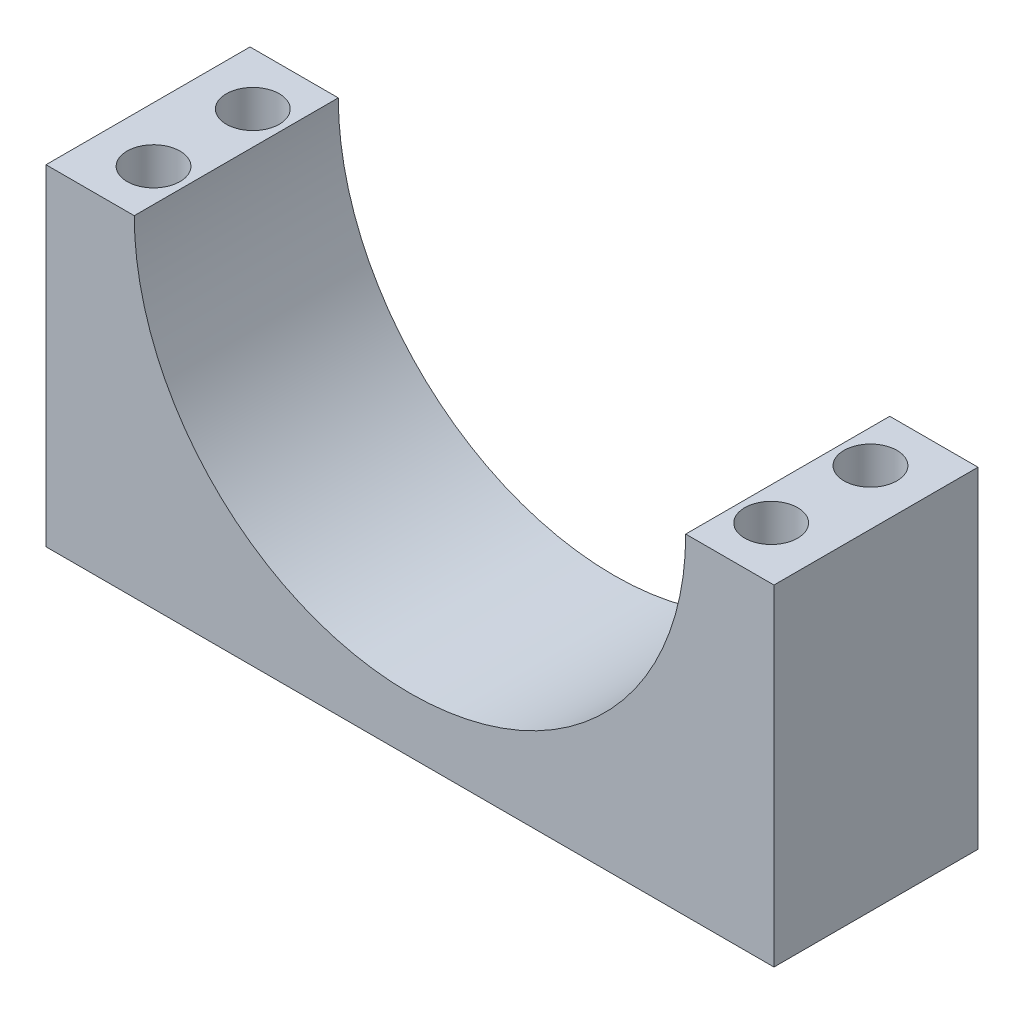
ISO-10303-21;
HEADER;
FILE_DESCRIPTION(('STEP AP214'),'2;1');
FILE_NAME('part.step','',(''),(''),'','','');
FILE_SCHEMA(('AUTOMOTIVE_DESIGN { 1 0 10303 214 1 1 1 1 }'));
ENDSEC;
DATA;
#1=APPLICATION_CONTEXT('core data for automotive mechanical design processes');
#2=APPLICATION_PROTOCOL_DEFINITION('international standard','automotive_design',2000,#1);
#3=PRODUCT_CONTEXT('',#1,'mechanical');
#4=PRODUCT('Part','Part','',(#3));
#5=PRODUCT_RELATED_PRODUCT_CATEGORY('part','',(#4));
#6=PRODUCT_DEFINITION_FORMATION('','',#4);
#7=PRODUCT_DEFINITION_CONTEXT('part definition',#1,'design');
#8=PRODUCT_DEFINITION('design','',#6,#7);
#9=PRODUCT_DEFINITION_SHAPE('','',#8);
#10=(LENGTH_UNIT() NAMED_UNIT(*) SI_UNIT(.MILLI.,.METRE.));
#11=(NAMED_UNIT(*) PLANE_ANGLE_UNIT() SI_UNIT($,.RADIAN.));
#12=(NAMED_UNIT(*) SI_UNIT($,.STERADIAN.) SOLID_ANGLE_UNIT());
#13=UNCERTAINTY_MEASURE_WITH_UNIT(LENGTH_MEASURE(1.E-05),#10,'distance_accuracy_value','');
#14=(GEOMETRIC_REPRESENTATION_CONTEXT(3) GLOBAL_UNCERTAINTY_ASSIGNED_CONTEXT((#13)) GLOBAL_UNIT_ASSIGNED_CONTEXT((#10,
#11,#12)) REPRESENTATION_CONTEXT('',''));
#15=CARTESIAN_POINT('',(0.,0.,0.));
#16=DIRECTION('',(0.,0.,1.));
#17=DIRECTION('',(1.,0.,0.));
#18=AXIS2_PLACEMENT_3D('',#15,#16,#17);
#19=CARTESIAN_POINT('',(0.,30.,18.5));
#20=DIRECTION('',(0.,-1.,0.));
#21=DIRECTION('',(0.,0.,-1.));
#22=AXIS2_PLACEMENT_3D('',#19,#20,#21);
#23=PLANE('',#22);
#24=CARTESIAN_POINT('',(61.,30.,13.75));
#25=DIRECTION('',(0.,-1.,0.));
#26=DIRECTION('',(0.,0.,-1.));
#27=AXIS2_PLACEMENT_3D('',#24,#25,#26);
#28=CIRCLE('',#27,2.39999999999999);
#29=CARTESIAN_POINT('',(61.,30.,11.35));
#30=VERTEX_POINT('',#29);
#31=EDGE_CURVE('E149',#30,#30,#28,.T.);
#32=ORIENTED_EDGE('',*,*,#31,.T.);
#33=EDGE_LOOP('',(#32));
#34=FACE_BOUND('',#33,.T.);
#35=CARTESIAN_POINT('',(61.,30.,4.75));
#36=DIRECTION('',(0.,-1.,0.));
#37=DIRECTION('',(0.,0.,-1.));
#38=AXIS2_PLACEMENT_3D('',#35,#36,#37);
#39=CIRCLE('',#38,2.39999999999999);
#40=CARTESIAN_POINT('',(61.,30.,2.35000000000001));
#41=VERTEX_POINT('',#40);
#42=EDGE_CURVE('E137',#41,#41,#39,.T.);
#43=ORIENTED_EDGE('',*,*,#42,.T.);
#44=EDGE_LOOP('',(#43));
#45=FACE_BOUND('',#44,.T.);
#46=DIRECTION('',(-1.,0.,0.));
#47=VECTOR('',#46,1.);
#48=CARTESIAN_POINT('',(0.,30.,0.));
#49=LINE('',#48,#47);
#50=CARTESIAN_POINT('',(66.,30.,0.));
#51=VERTEX_POINT('',#50);
#52=CARTESIAN_POINT('',(58.,30.,0.));
#53=VERTEX_POINT('',#52);
#54=EDGE_CURVE('E107',#51,#53,#49,.T.);
#55=ORIENTED_EDGE('',*,*,#54,.T.);
#56=DIRECTION('',(0.,0.,1.));
#57=VECTOR('',#56,1.);
#58=CARTESIAN_POINT('',(58.,30.,0.));
#59=LINE('',#58,#57);
#60=CARTESIAN_POINT('',(58.,30.,18.5));
#61=VERTEX_POINT('',#60);
#62=EDGE_CURVE('E49',#53,#61,#59,.T.);
#63=ORIENTED_EDGE('',*,*,#62,.T.);
#64=DIRECTION('',(-1.,0.,0.));
#65=VECTOR('',#64,1.);
#66=CARTESIAN_POINT('',(0.,30.,18.5));
#67=LINE('',#66,#65);
#68=CARTESIAN_POINT('',(66.,30.,18.5));
#69=VERTEX_POINT('',#68);
#70=EDGE_CURVE('E118',#69,#61,#67,.T.);
#71=ORIENTED_EDGE('',*,*,#70,.F.);
#72=DIRECTION('',(0.,0.,-1.));
#73=VECTOR('',#72,1.);
#74=CARTESIAN_POINT('',(66.,30.,18.5));
#75=LINE('',#74,#73);
#76=EDGE_CURVE('E117',#69,#51,#75,.T.);
#77=ORIENTED_EDGE('',*,*,#76,.T.);
#78=EDGE_LOOP('',(#55,#63,#71,#77));
#79=FACE_BOUND('',#78,.T.);
#80=ADVANCED_FACE('F35',(#34,#45,#79),#23,.F.);
#81=CARTESIAN_POINT('',(0.,0.,18.5));
#82=DIRECTION('',(1.,0.,0.));
#83=DIRECTION('',(0.,0.,-1.));
#84=AXIS2_PLACEMENT_3D('',#81,#82,#83);
#85=PLANE('',#84);
#86=DIRECTION('',(0.,-1.,0.));
#87=VECTOR('',#86,1.);
#88=CARTESIAN_POINT('',(0.,0.,0.));
#89=LINE('',#88,#87);
#90=CARTESIAN_POINT('',(0.,30.,0.));
#91=VERTEX_POINT('',#90);
#92=CARTESIAN_POINT('',(0.,0.,0.));
#93=VERTEX_POINT('',#92);
#94=EDGE_CURVE('E106',#91,#93,#89,.T.);
#95=ORIENTED_EDGE('',*,*,#94,.T.);
#96=DIRECTION('',(0.,0.,-1.));
#97=VECTOR('',#96,1.);
#98=CARTESIAN_POINT('',(0.,0.,18.5));
#99=LINE('',#98,#97);
#100=CARTESIAN_POINT('',(0.,0.,18.5));
#101=VERTEX_POINT('',#100);
#102=EDGE_CURVE('E43',#101,#93,#99,.T.);
#103=ORIENTED_EDGE('',*,*,#102,.F.);
#104=DIRECTION('',(0.,-1.,0.));
#105=VECTOR('',#104,1.);
#106=CARTESIAN_POINT('',(0.,0.,18.5));
#107=LINE('',#106,#105);
#108=CARTESIAN_POINT('',(0.,30.,18.5));
#109=VERTEX_POINT('',#108);
#110=EDGE_CURVE('E110',#109,#101,#107,.T.);
#111=ORIENTED_EDGE('',*,*,#110,.F.);
#112=DIRECTION('',(0.,0.,-1.));
#113=VECTOR('',#112,1.);
#114=CARTESIAN_POINT('',(0.,30.,18.5));
#115=LINE('',#114,#113);
#116=EDGE_CURVE('E115',#109,#91,#115,.T.);
#117=ORIENTED_EDGE('',*,*,#116,.T.);
#118=EDGE_LOOP('',(#95,#103,#111,#117));
#119=FACE_BOUND('',#118,.T.);
#120=ADVANCED_FACE('F37',(#119),#85,.F.);
#121=CARTESIAN_POINT('',(0.,0.,18.5));
#122=DIRECTION('',(0.,1.,0.));
#123=DIRECTION('',(0.,0.,1.));
#124=AXIS2_PLACEMENT_3D('',#121,#122,#123);
#125=PLANE('',#124);
#126=CARTESIAN_POINT('',(5.00000000000001,0.,13.75));
#127=DIRECTION('',(0.,-1.,0.));
#128=DIRECTION('',(0.,0.,-1.));
#129=AXIS2_PLACEMENT_3D('',#126,#127,#128);
#130=CIRCLE('',#129,3.99999999999999);
#131=CARTESIAN_POINT('',(5.00000000000001,0.,9.75000000000001));
#132=VERTEX_POINT('',#131);
#133=EDGE_CURVE('E182',#132,#132,#130,.T.);
#134=ORIENTED_EDGE('',*,*,#133,.F.);
#135=EDGE_LOOP('',(#134));
#136=FACE_BOUND('',#135,.T.);
#137=CARTESIAN_POINT('',(5.00000000000001,0.,4.75));
#138=DIRECTION('',(0.,-1.,0.));
#139=DIRECTION('',(0.,0.,-1.));
#140=AXIS2_PLACEMENT_3D('',#137,#138,#139);
#141=CIRCLE('',#140,3.99999999999999);
#142=CARTESIAN_POINT('',(5.00000000000001,0.,0.750000000000007));
#143=VERTEX_POINT('',#142);
#144=EDGE_CURVE('E170',#143,#143,#141,.T.);
#145=ORIENTED_EDGE('',*,*,#144,.F.);
#146=EDGE_LOOP('',(#145));
#147=FACE_BOUND('',#146,.T.);
#148=CARTESIAN_POINT('',(61.,0.,13.75));
#149=DIRECTION('',(0.,-1.,0.));
#150=DIRECTION('',(0.,0.,-1.));
#151=AXIS2_PLACEMENT_3D('',#148,#149,#150);
#152=CIRCLE('',#151,4.);
#153=CARTESIAN_POINT('',(61.,0.,9.75));
#154=VERTEX_POINT('',#153);
#155=EDGE_CURVE('E158',#154,#154,#152,.T.);
#156=ORIENTED_EDGE('',*,*,#155,.F.);
#157=EDGE_LOOP('',(#156));
#158=FACE_BOUND('',#157,.T.);
#159=CARTESIAN_POINT('',(61.,0.,4.75));
#160=DIRECTION('',(0.,-1.,0.));
#161=DIRECTION('',(0.,0.,-1.));
#162=AXIS2_PLACEMENT_3D('',#159,#160,#161);
#163=CIRCLE('',#162,4.);
#164=CARTESIAN_POINT('',(61.,0.,0.750000000000003));
#165=VERTEX_POINT('',#164);
#166=EDGE_CURVE('E146',#165,#165,#163,.T.);
#167=ORIENTED_EDGE('',*,*,#166,.F.);
#168=EDGE_LOOP('',(#167));
#169=FACE_BOUND('',#168,.T.);
#170=DIRECTION('',(1.,0.,0.));
#171=VECTOR('',#170,1.);
#172=CARTESIAN_POINT('',(0.,0.,0.));
#173=LINE('',#172,#171);
#174=CARTESIAN_POINT('',(66.,0.,0.));
#175=VERTEX_POINT('',#174);
#176=EDGE_CURVE('E111',#93,#175,#173,.T.);
#177=ORIENTED_EDGE('',*,*,#176,.T.);
#178=DIRECTION('',(0.,0.,-1.));
#179=VECTOR('',#178,1.);
#180=CARTESIAN_POINT('',(66.,0.,18.5));
#181=LINE('',#180,#179);
#182=CARTESIAN_POINT('',(66.,0.,18.5));
#183=VERTEX_POINT('',#182);
#184=EDGE_CURVE('E121',#183,#175,#181,.T.);
#185=ORIENTED_EDGE('',*,*,#184,.F.);
#186=DIRECTION('',(1.,0.,0.));
#187=VECTOR('',#186,1.);
#188=CARTESIAN_POINT('',(0.,0.,18.5));
#189=LINE('',#188,#187);
#190=EDGE_CURVE('E88',#101,#183,#189,.T.);
#191=ORIENTED_EDGE('',*,*,#190,.F.);
#192=ORIENTED_EDGE('',*,*,#102,.T.);
#193=EDGE_LOOP('',(#177,#185,#191,#192));
#194=FACE_BOUND('',#193,.T.);
#195=ADVANCED_FACE('F124',(#136,#147,#158,#169,#194),#125,.F.);
#196=CARTESIAN_POINT('',(66.,0.,18.5));
#197=DIRECTION('',(-1.,0.,0.));
#198=DIRECTION('',(0.,0.,1.));
#199=AXIS2_PLACEMENT_3D('',#196,#197,#198);
#200=PLANE('',#199);
#201=DIRECTION('',(0.,1.,0.));
#202=VECTOR('',#201,1.);
#203=CARTESIAN_POINT('',(66.,0.,0.));
#204=LINE('',#203,#202);
#205=EDGE_CURVE('E108',#175,#51,#204,.T.);
#206=ORIENTED_EDGE('',*,*,#205,.T.);
#207=ORIENTED_EDGE('',*,*,#76,.F.);
#208=DIRECTION('',(0.,1.,0.));
#209=VECTOR('',#208,1.);
#210=CARTESIAN_POINT('',(66.,0.,18.5));
#211=LINE('',#210,#209);
#212=EDGE_CURVE('E132',#183,#69,#211,.T.);
#213=ORIENTED_EDGE('',*,*,#212,.F.);
#214=ORIENTED_EDGE('',*,*,#184,.T.);
#215=EDGE_LOOP('',(#206,#207,#213,#214));
#216=FACE_BOUND('',#215,.T.);
#217=ADVANCED_FACE('F190',(#216),#200,.F.);
#218=CARTESIAN_POINT('',(5.00000000000001,30.,13.75));
#219=DIRECTION('',(0.,-1.,0.));
#220=DIRECTION('',(0.,0.,-1.));
#221=AXIS2_PLACEMENT_3D('',#218,#219,#220);
#222=CIRCLE('',#221,2.39999999999999);
#223=CARTESIAN_POINT('',(5.00000000000001,30.,11.35));
#224=VERTEX_POINT('',#223);
#225=EDGE_CURVE('E173',#224,#224,#222,.T.);
#226=ORIENTED_EDGE('',*,*,#225,.T.);
#227=EDGE_LOOP('',(#226));
#228=FACE_BOUND('',#227,.T.);
#229=CARTESIAN_POINT('',(5.00000000000001,30.,4.75));
#230=DIRECTION('',(0.,-1.,0.));
#231=DIRECTION('',(0.,0.,-1.));
#232=AXIS2_PLACEMENT_3D('',#229,#230,#231);
#233=CIRCLE('',#232,2.39999999999999);
#234=CARTESIAN_POINT('',(5.00000000000001,30.,2.35000000000001));
#235=VERTEX_POINT('',#234);
#236=EDGE_CURVE('E161',#235,#235,#233,.T.);
#237=ORIENTED_EDGE('',*,*,#236,.T.);
#238=EDGE_LOOP('',(#237));
#239=FACE_BOUND('',#238,.T.);
#240=CARTESIAN_POINT('',(8.,30.,18.5));
#241=VERTEX_POINT('',#240);
#242=EDGE_CURVE('E58',#241,#109,#67,.T.);
#243=ORIENTED_EDGE('',*,*,#242,.F.);
#244=DIRECTION('',(0.,0.,1.));
#245=VECTOR('',#244,1.);
#246=CARTESIAN_POINT('',(8.,30.,0.));
#247=LINE('',#246,#245);
#248=CARTESIAN_POINT('',(8.,30.,0.));
#249=VERTEX_POINT('',#248);
#250=EDGE_CURVE('E96',#241,#249,#247,.F.);
#251=ORIENTED_EDGE('',*,*,#250,.T.);
#252=EDGE_CURVE('E80',#249,#91,#49,.T.);
#253=ORIENTED_EDGE('',*,*,#252,.T.);
#254=ORIENTED_EDGE('',*,*,#116,.F.);
#255=EDGE_LOOP('',(#243,#251,#253,#254));
#256=FACE_BOUND('',#255,.T.);
#257=ADVANCED_FACE('F100',(#228,#239,#256),#23,.F.);
#258=CARTESIAN_POINT('',(0.,30.,18.5));
#259=DIRECTION('',(0.,0.,-1.));
#260=DIRECTION('',(-1.,0.,0.));
#261=AXIS2_PLACEMENT_3D('',#258,#259,#260);
#262=PLANE('',#261);
#263=ORIENTED_EDGE('',*,*,#70,.T.);
#264=CARTESIAN_POINT('',(33.,30.,18.5));
#265=DIRECTION('',(0.,0.,1.));
#266=DIRECTION('',(1.,0.,0.));
#267=AXIS2_PLACEMENT_3D('',#264,#265,#266);
#268=CIRCLE('',#267,25.);
#269=EDGE_CURVE('E101',#241,#61,#268,.T.);
#270=ORIENTED_EDGE('',*,*,#269,.F.);
#271=ORIENTED_EDGE('',*,*,#242,.T.);
#272=ORIENTED_EDGE('',*,*,#110,.T.);
#273=ORIENTED_EDGE('',*,*,#190,.T.);
#274=ORIENTED_EDGE('',*,*,#212,.T.);
#275=EDGE_LOOP('',(#263,#270,#271,#272,#273,#274));
#276=FACE_BOUND('',#275,.T.);
#277=ADVANCED_FACE('F224',(#276),#262,.F.);
#278=CARTESIAN_POINT('',(0.,30.,0.));
#279=DIRECTION('',(0.,0.,-1.));
#280=DIRECTION('',(-1.,0.,0.));
#281=AXIS2_PLACEMENT_3D('',#278,#279,#280);
#282=PLANE('',#281);
#283=CARTESIAN_POINT('',(33.,30.,0.));
#284=DIRECTION('',(0.,0.,-1.));
#285=DIRECTION('',(-1.,0.,0.));
#286=AXIS2_PLACEMENT_3D('',#283,#284,#285);
#287=CIRCLE('',#286,25.);
#288=EDGE_CURVE('E11',#53,#249,#287,.T.);
#289=ORIENTED_EDGE('',*,*,#288,.F.);
#290=ORIENTED_EDGE('',*,*,#54,.F.);
#291=ORIENTED_EDGE('',*,*,#205,.F.);
#292=ORIENTED_EDGE('',*,*,#176,.F.);
#293=ORIENTED_EDGE('',*,*,#94,.F.);
#294=ORIENTED_EDGE('',*,*,#252,.F.);
#295=EDGE_LOOP('',(#289,#290,#291,#292,#293,#294));
#296=FACE_BOUND('',#295,.T.);
#297=ADVANCED_FACE('F104',(#296),#282,.T.);
#298=CARTESIAN_POINT('',(33.,30.,0.));
#299=DIRECTION('',(0.,0.,1.));
#300=DIRECTION('',(1.,0.,0.));
#301=AXIS2_PLACEMENT_3D('',#298,#299,#300);
#302=CYLINDRICAL_SURFACE('',#301,25.);
#303=ORIENTED_EDGE('',*,*,#288,.T.);
#304=ORIENTED_EDGE('',*,*,#250,.F.);
#305=ORIENTED_EDGE('',*,*,#269,.T.);
#306=ORIENTED_EDGE('',*,*,#62,.F.);
#307=EDGE_LOOP('',(#303,#304,#305,#306));
#308=FACE_BOUND('',#307,.T.);
#309=ADVANCED_FACE('F95',(#308),#302,.F.);
#310=CARTESIAN_POINT('',(61.,0.,4.75));
#311=DIRECTION('',(0.,-1.,0.));
#312=DIRECTION('',(0.,0.,-1.));
#313=AXIS2_PLACEMENT_3D('',#310,#311,#312);
#314=CYLINDRICAL_SURFACE('',#313,2.39999999999999);
#315=ORIENTED_EDGE('',*,*,#42,.F.);
#316=EDGE_LOOP('',(#315));
#317=FACE_BOUND('',#316,.T.);
#318=CARTESIAN_POINT('',(61.,4.,4.75));
#319=DIRECTION('',(0.,-1.,0.));
#320=DIRECTION('',(0.,0.,-1.));
#321=AXIS2_PLACEMENT_3D('',#318,#319,#320);
#322=CIRCLE('',#321,2.39999999999999);
#323=CARTESIAN_POINT('',(61.,4.,2.35000000000001));
#324=VERTEX_POINT('',#323);
#325=EDGE_CURVE('E140',#324,#324,#322,.T.);
#326=ORIENTED_EDGE('',*,*,#325,.T.);
#327=EDGE_LOOP('',(#326));
#328=FACE_BOUND('',#327,.T.);
#329=ADVANCED_FACE('F210',(#317,#328),#314,.F.);
#330=CARTESIAN_POINT('',(63.4,4.,4.75));
#331=DIRECTION('',(0.,1.,0.));
#332=DIRECTION('',(0.,0.,1.));
#333=AXIS2_PLACEMENT_3D('',#330,#331,#332);
#334=PLANE('',#333);
#335=ORIENTED_EDGE('',*,*,#325,.F.);
#336=EDGE_LOOP('',(#335));
#337=FACE_BOUND('',#336,.T.);
#338=CARTESIAN_POINT('',(61.,4.,4.75));
#339=DIRECTION('',(0.,-1.,0.));
#340=DIRECTION('',(0.,0.,-1.));
#341=AXIS2_PLACEMENT_3D('',#338,#339,#340);
#342=CIRCLE('',#341,4.);
#343=CARTESIAN_POINT('',(61.,4.,0.750000000000003));
#344=VERTEX_POINT('',#343);
#345=EDGE_CURVE('E143',#344,#344,#342,.T.);
#346=ORIENTED_EDGE('',*,*,#345,.T.);
#347=EDGE_LOOP('',(#346));
#348=FACE_BOUND('',#347,.T.);
#349=ADVANCED_FACE('F200',(#337,#348),#334,.F.);
#350=CARTESIAN_POINT('',(61.,0.,4.75));
#351=DIRECTION('',(0.,-1.,0.));
#352=DIRECTION('',(0.,0.,-1.));
#353=AXIS2_PLACEMENT_3D('',#350,#351,#352);
#354=CYLINDRICAL_SURFACE('',#353,4.);
#355=ORIENTED_EDGE('',*,*,#345,.F.);
#356=EDGE_LOOP('',(#355));
#357=FACE_BOUND('',#356,.T.);
#358=ORIENTED_EDGE('',*,*,#166,.T.);
#359=EDGE_LOOP('',(#358));
#360=FACE_BOUND('',#359,.T.);
#361=ADVANCED_FACE('F197',(#357,#360),#354,.F.);
#362=CARTESIAN_POINT('',(61.,0.,13.75));
#363=DIRECTION('',(0.,-1.,0.));
#364=DIRECTION('',(0.,0.,-1.));
#365=AXIS2_PLACEMENT_3D('',#362,#363,#364);
#366=CYLINDRICAL_SURFACE('',#365,2.39999999999999);
#367=ORIENTED_EDGE('',*,*,#31,.F.);
#368=EDGE_LOOP('',(#367));
#369=FACE_BOUND('',#368,.T.);
#370=CARTESIAN_POINT('',(61.,4.,13.75));
#371=DIRECTION('',(0.,-1.,0.));
#372=DIRECTION('',(0.,0.,-1.));
#373=AXIS2_PLACEMENT_3D('',#370,#371,#372);
#374=CIRCLE('',#373,2.39999999999999);
#375=CARTESIAN_POINT('',(61.,4.,11.35));
#376=VERTEX_POINT('',#375);
#377=EDGE_CURVE('E152',#376,#376,#374,.T.);
#378=ORIENTED_EDGE('',*,*,#377,.T.);
#379=EDGE_LOOP('',(#378));
#380=FACE_BOUND('',#379,.T.);
#381=ADVANCED_FACE('F199',(#369,#380),#366,.F.);
#382=CARTESIAN_POINT('',(63.4,4.,13.75));
#383=DIRECTION('',(0.,1.,0.));
#384=DIRECTION('',(0.,0.,1.));
#385=AXIS2_PLACEMENT_3D('',#382,#383,#384);
#386=PLANE('',#385);
#387=ORIENTED_EDGE('',*,*,#377,.F.);
#388=EDGE_LOOP('',(#387));
#389=FACE_BOUND('',#388,.T.);
#390=CARTESIAN_POINT('',(61.,4.,13.75));
#391=DIRECTION('',(0.,-1.,0.));
#392=DIRECTION('',(0.,0.,-1.));
#393=AXIS2_PLACEMENT_3D('',#390,#391,#392);
#394=CIRCLE('',#393,4.);
#395=CARTESIAN_POINT('',(61.,4.,9.75));
#396=VERTEX_POINT('',#395);
#397=EDGE_CURVE('E155',#396,#396,#394,.T.);
#398=ORIENTED_EDGE('',*,*,#397,.T.);
#399=EDGE_LOOP('',(#398));
#400=FACE_BOUND('',#399,.T.);
#401=ADVANCED_FACE('F207',(#389,#400),#386,.F.);
#402=CARTESIAN_POINT('',(61.,0.,13.75));
#403=DIRECTION('',(0.,-1.,0.));
#404=DIRECTION('',(0.,0.,-1.));
#405=AXIS2_PLACEMENT_3D('',#402,#403,#404);
#406=CYLINDRICAL_SURFACE('',#405,4.);
#407=ORIENTED_EDGE('',*,*,#397,.F.);
#408=EDGE_LOOP('',(#407));
#409=FACE_BOUND('',#408,.T.);
#410=ORIENTED_EDGE('',*,*,#155,.T.);
#411=EDGE_LOOP('',(#410));
#412=FACE_BOUND('',#411,.T.);
#413=ADVANCED_FACE('F240',(#409,#412),#406,.F.);
#414=CARTESIAN_POINT('',(5.00000000000001,0.,4.75));
#415=DIRECTION('',(0.,-1.,0.));
#416=DIRECTION('',(0.,0.,-1.));
#417=AXIS2_PLACEMENT_3D('',#414,#415,#416);
#418=CYLINDRICAL_SURFACE('',#417,2.4);
#419=ORIENTED_EDGE('',*,*,#236,.F.);
#420=EDGE_LOOP('',(#419));
#421=FACE_BOUND('',#420,.T.);
#422=CARTESIAN_POINT('',(5.00000000000001,4.,4.75));
#423=DIRECTION('',(0.,-1.,0.));
#424=DIRECTION('',(0.,0.,-1.));
#425=AXIS2_PLACEMENT_3D('',#422,#423,#424);
#426=CIRCLE('',#425,2.4);
#427=CARTESIAN_POINT('',(5.00000000000001,4.,2.35));
#428=VERTEX_POINT('',#427);
#429=EDGE_CURVE('E164',#428,#428,#426,.T.);
#430=ORIENTED_EDGE('',*,*,#429,.T.);
#431=EDGE_LOOP('',(#430));
#432=FACE_BOUND('',#431,.T.);
#433=ADVANCED_FACE('F236',(#421,#432),#418,.F.);
#434=CARTESIAN_POINT('',(7.40000000000001,4.,4.75));
#435=DIRECTION('',(0.,1.,0.));
#436=DIRECTION('',(0.,0.,1.));
#437=AXIS2_PLACEMENT_3D('',#434,#435,#436);
#438=PLANE('',#437);
#439=ORIENTED_EDGE('',*,*,#429,.F.);
#440=EDGE_LOOP('',(#439));
#441=FACE_BOUND('',#440,.T.);
#442=CARTESIAN_POINT('',(5.00000000000001,4.,4.75));
#443=DIRECTION('',(0.,-1.,0.));
#444=DIRECTION('',(0.,0.,-1.));
#445=AXIS2_PLACEMENT_3D('',#442,#443,#444);
#446=CIRCLE('',#445,4.);
#447=CARTESIAN_POINT('',(5.00000000000001,4.,0.750000000000003));
#448=VERTEX_POINT('',#447);
#449=EDGE_CURVE('E167',#448,#448,#446,.T.);
#450=ORIENTED_EDGE('',*,*,#449,.T.);
#451=EDGE_LOOP('',(#450));
#452=FACE_BOUND('',#451,.T.);
#453=ADVANCED_FACE('F239',(#441,#452),#438,.F.);
#454=CARTESIAN_POINT('',(5.00000000000001,0.,4.75));
#455=DIRECTION('',(0.,-1.,0.));
#456=DIRECTION('',(0.,0.,-1.));
#457=AXIS2_PLACEMENT_3D('',#454,#455,#456);
#458=CYLINDRICAL_SURFACE('',#457,3.99999999999999);
#459=ORIENTED_EDGE('',*,*,#449,.F.);
#460=EDGE_LOOP('',(#459));
#461=FACE_BOUND('',#460,.T.);
#462=ORIENTED_EDGE('',*,*,#144,.T.);
#463=EDGE_LOOP('',(#462));
#464=FACE_BOUND('',#463,.T.);
#465=ADVANCED_FACE('F246',(#461,#464),#458,.F.);
#466=CARTESIAN_POINT('',(5.00000000000001,0.,13.75));
#467=DIRECTION('',(0.,-1.,0.));
#468=DIRECTION('',(0.,0.,-1.));
#469=AXIS2_PLACEMENT_3D('',#466,#467,#468);
#470=CYLINDRICAL_SURFACE('',#469,2.4);
#471=ORIENTED_EDGE('',*,*,#225,.F.);
#472=EDGE_LOOP('',(#471));
#473=FACE_BOUND('',#472,.T.);
#474=CARTESIAN_POINT('',(5.00000000000001,4.,13.75));
#475=DIRECTION('',(0.,-1.,0.));
#476=DIRECTION('',(0.,0.,-1.));
#477=AXIS2_PLACEMENT_3D('',#474,#475,#476);
#478=CIRCLE('',#477,2.4);
#479=CARTESIAN_POINT('',(5.00000000000001,4.,11.35));
#480=VERTEX_POINT('',#479);
#481=EDGE_CURVE('E176',#480,#480,#478,.T.);
#482=ORIENTED_EDGE('',*,*,#481,.T.);
#483=EDGE_LOOP('',(#482));
#484=FACE_BOUND('',#483,.T.);
#485=ADVANCED_FACE('F252',(#473,#484),#470,.F.);
#486=CARTESIAN_POINT('',(7.40000000000001,4.,13.75));
#487=DIRECTION('',(0.,1.,0.));
#488=DIRECTION('',(0.,0.,1.));
#489=AXIS2_PLACEMENT_3D('',#486,#487,#488);
#490=PLANE('',#489);
#491=ORIENTED_EDGE('',*,*,#481,.F.);
#492=EDGE_LOOP('',(#491));
#493=FACE_BOUND('',#492,.T.);
#494=CARTESIAN_POINT('',(5.00000000000001,4.,13.75));
#495=DIRECTION('',(0.,-1.,0.));
#496=DIRECTION('',(0.,0.,-1.));
#497=AXIS2_PLACEMENT_3D('',#494,#495,#496);
#498=CIRCLE('',#497,4.);
#499=CARTESIAN_POINT('',(5.00000000000001,4.,9.75));
#500=VERTEX_POINT('',#499);
#501=EDGE_CURVE('E179',#500,#500,#498,.T.);
#502=ORIENTED_EDGE('',*,*,#501,.T.);
#503=EDGE_LOOP('',(#502));
#504=FACE_BOUND('',#503,.T.);
#505=ADVANCED_FACE('F257',(#493,#504),#490,.F.);
#506=CARTESIAN_POINT('',(5.00000000000001,0.,13.75));
#507=DIRECTION('',(0.,-1.,0.));
#508=DIRECTION('',(0.,0.,-1.));
#509=AXIS2_PLACEMENT_3D('',#506,#507,#508);
#510=CYLINDRICAL_SURFACE('',#509,3.99999999999999);
#511=ORIENTED_EDGE('',*,*,#501,.F.);
#512=EDGE_LOOP('',(#511));
#513=FACE_BOUND('',#512,.T.);
#514=ORIENTED_EDGE('',*,*,#133,.T.);
#515=EDGE_LOOP('',(#514));
#516=FACE_BOUND('',#515,.T.);
#517=ADVANCED_FACE('F186',(#513,#516),#510,.F.);
#518=CLOSED_SHELL('',(#80,#120,#195,#217,#257,#277,#297,#309,#329,#349,#361,#381,#401,#413,#433,
#453,#465,#485,#505,#517));
#519=MANIFOLD_SOLID_BREP('B2',#518);
#520=ADVANCED_BREP_SHAPE_REPRESENTATION('',(#18,#519),#14);
#521=SHAPE_DEFINITION_REPRESENTATION(#9,#520);
ENDSEC;
END-ISO-10303-21;
